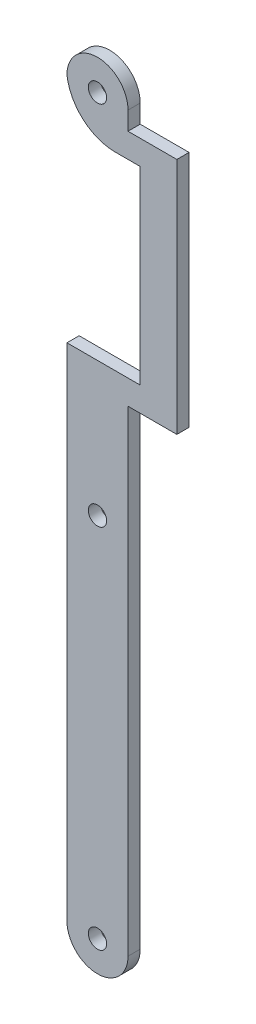
ISO-10303-21;
HEADER;
FILE_DESCRIPTION(('STEP AP214'),'2;1');
FILE_NAME('part.step','',(''),(''),'','','');
FILE_SCHEMA(('AUTOMOTIVE_DESIGN { 1 0 10303 214 1 1 1 1 }'));
ENDSEC;
DATA;
#1=APPLICATION_CONTEXT('core data for automotive mechanical design processes');
#2=APPLICATION_PROTOCOL_DEFINITION('international standard','automotive_design',2000,#1);
#3=PRODUCT_CONTEXT('',#1,'mechanical');
#4=PRODUCT('Part','Part','',(#3));
#5=PRODUCT_RELATED_PRODUCT_CATEGORY('part','',(#4));
#6=PRODUCT_DEFINITION_FORMATION('','',#4);
#7=PRODUCT_DEFINITION_CONTEXT('part definition',#1,'design');
#8=PRODUCT_DEFINITION('design','',#6,#7);
#9=PRODUCT_DEFINITION_SHAPE('','',#8);
#10=(LENGTH_UNIT() NAMED_UNIT(*) SI_UNIT(.MILLI.,.METRE.));
#11=(NAMED_UNIT(*) PLANE_ANGLE_UNIT() SI_UNIT($,.RADIAN.));
#12=(NAMED_UNIT(*) SI_UNIT($,.STERADIAN.) SOLID_ANGLE_UNIT());
#13=UNCERTAINTY_MEASURE_WITH_UNIT(LENGTH_MEASURE(1.E-05),#10,'distance_accuracy_value','');
#14=(GEOMETRIC_REPRESENTATION_CONTEXT(3) GLOBAL_UNCERTAINTY_ASSIGNED_CONTEXT((#13)) GLOBAL_UNIT_ASSIGNED_CONTEXT((#10,
#11,#12)) REPRESENTATION_CONTEXT('',''));
#15=CARTESIAN_POINT('',(0.,0.,0.));
#16=DIRECTION('',(0.,0.,1.));
#17=DIRECTION('',(1.,0.,0.));
#18=AXIS2_PLACEMENT_3D('',#15,#16,#17);
#19=CARTESIAN_POINT('',(5.00000000000001,60.,2.));
#20=DIRECTION('',(-1.,0.,0.));
#21=DIRECTION('',(0.,0.,1.));
#22=AXIS2_PLACEMENT_3D('',#19,#20,#21);
#23=PLANE('',#22);
#24=DIRECTION('',(0.,1.,0.));
#25=VECTOR('',#24,1.);
#26=CARTESIAN_POINT('',(5.00000000000001,60.,0.));
#27=LINE('',#26,#25);
#28=CARTESIAN_POINT('',(5.00000000000001,-60.,0.));
#29=VERTEX_POINT('',#28);
#30=CARTESIAN_POINT('',(5.00000000000001,18.,0.));
#31=VERTEX_POINT('',#30);
#32=EDGE_CURVE('E229',#29,#31,#27,.T.);
#33=ORIENTED_EDGE('',*,*,#32,.T.);
#34=DIRECTION('',(0.,0.,-1.));
#35=VECTOR('',#34,1.);
#36=CARTESIAN_POINT('',(5.00000000000001,18.,2.));
#37=LINE('',#36,#35);
#38=CARTESIAN_POINT('',(5.00000000000001,18.,2.));
#39=VERTEX_POINT('',#38);
#40=EDGE_CURVE('E161',#39,#31,#37,.T.);
#41=ORIENTED_EDGE('',*,*,#40,.F.);
#42=DIRECTION('',(0.,1.,0.));
#43=VECTOR('',#42,1.);
#44=CARTESIAN_POINT('',(5.00000000000001,60.,2.));
#45=LINE('',#44,#43);
#46=CARTESIAN_POINT('',(5.00000000000001,-60.,2.));
#47=VERTEX_POINT('',#46);
#48=EDGE_CURVE('E236',#47,#39,#45,.T.);
#49=ORIENTED_EDGE('',*,*,#48,.F.);
#50=DIRECTION('',(0.,0.,-1.));
#51=VECTOR('',#50,1.);
#52=CARTESIAN_POINT('',(5.00000000000001,-60.,2.));
#53=LINE('',#52,#51);
#54=EDGE_CURVE('E257',#47,#29,#53,.T.);
#55=ORIENTED_EDGE('',*,*,#54,.T.);
#56=EDGE_LOOP('',(#33,#41,#49,#55));
#57=FACE_BOUND('',#56,.T.);
#58=ADVANCED_FACE('F38',(#57),#23,.F.);
#59=CARTESIAN_POINT('',(13.,53.,0.));
#60=DIRECTION('',(0.,-1.,0.));
#61=DIRECTION('',(0.,0.,-1.));
#62=AXIS2_PLACEMENT_3D('',#59,#60,#61);
#63=PLANE('',#62);
#64=DIRECTION('',(-1.,0.,0.));
#65=VECTOR('',#64,1.);
#66=CARTESIAN_POINT('',(13.,53.,2.));
#67=LINE('',#66,#65);
#68=CARTESIAN_POINT('',(7.00000000000001,53.,2.));
#69=VERTEX_POINT('',#68);
#70=CARTESIAN_POINT('',(2.93725393319378,53.,2.));
#71=VERTEX_POINT('',#70);
#72=EDGE_CURVE('E143',#69,#71,#67,.T.);
#73=ORIENTED_EDGE('',*,*,#72,.T.);
#74=DIRECTION('',(0.,0.,1.));
#75=VECTOR('',#74,1.);
#76=CARTESIAN_POINT('',(2.93725393319378,53.,0.));
#77=LINE('',#76,#75);
#78=CARTESIAN_POINT('',(2.93725393319378,53.,0.));
#79=VERTEX_POINT('',#78);
#80=EDGE_CURVE('E272',#71,#79,#77,.F.);
#81=ORIENTED_EDGE('',*,*,#80,.T.);
#82=DIRECTION('',(-1.,0.,0.));
#83=VECTOR('',#82,1.);
#84=CARTESIAN_POINT('',(13.,53.,0.));
#85=LINE('',#84,#83);
#86=CARTESIAN_POINT('',(7.00000000000001,53.,0.));
#87=VERTEX_POINT('',#86);
#88=EDGE_CURVE('E187',#87,#79,#85,.T.);
#89=ORIENTED_EDGE('',*,*,#88,.F.);
#90=DIRECTION('',(0.,0.,-1.));
#91=VECTOR('',#90,1.);
#92=CARTESIAN_POINT('',(7.00000000000001,53.,33.1448230047949));
#93=LINE('',#92,#91);
#94=EDGE_CURVE('E147',#69,#87,#93,.T.);
#95=ORIENTED_EDGE('',*,*,#94,.F.);
#96=EDGE_LOOP('',(#73,#81,#89,#95));
#97=FACE_BOUND('',#96,.T.);
#98=ADVANCED_FACE('F286',(#97),#63,.T.);
#99=CARTESIAN_POINT('',(5.00000000000002,57.,2.));
#100=VERTEX_POINT('',#99);
#101=CARTESIAN_POINT('',(5.00000000000001,60.,2.));
#102=VERTEX_POINT('',#101);
#103=EDGE_CURVE('E235',#100,#102,#45,.T.);
#104=ORIENTED_EDGE('',*,*,#103,.F.);
#105=DIRECTION('',(0.,0.,-1.));
#106=VECTOR('',#105,1.);
#107=CARTESIAN_POINT('',(5.00000000000001,57.,2.));
#108=LINE('',#107,#106);
#109=CARTESIAN_POINT('',(5.00000000000002,57.,0.));
#110=VERTEX_POINT('',#109);
#111=EDGE_CURVE('E268',#100,#110,#108,.T.);
#112=ORIENTED_EDGE('',*,*,#111,.T.);
#113=CARTESIAN_POINT('',(5.00000000000001,60.,0.));
#114=VERTEX_POINT('',#113);
#115=EDGE_CURVE('E250',#110,#114,#27,.T.);
#116=ORIENTED_EDGE('',*,*,#115,.T.);
#117=DIRECTION('',(0.,0.,-1.));
#118=VECTOR('',#117,1.);
#119=CARTESIAN_POINT('',(5.00000000000001,60.,2.));
#120=LINE('',#119,#118);
#121=EDGE_CURVE('E240',#102,#114,#120,.T.);
#122=ORIENTED_EDGE('',*,*,#121,.F.);
#123=EDGE_LOOP('',(#104,#112,#116,#122));
#124=FACE_BOUND('',#123,.T.);
#125=ADVANCED_FACE('F293',(#124),#23,.F.);
#126=CARTESIAN_POINT('',(0.,60.,2.));
#127=DIRECTION('',(0.,0.,1.));
#128=DIRECTION('',(1.,0.,0.));
#129=AXIS2_PLACEMENT_3D('',#126,#127,#128);
#130=PLANE('',#129);
#131=CARTESIAN_POINT('',(0.,60.,2.));
#132=DIRECTION('',(0.,0.,1.));
#133=DIRECTION('',(1.,0.,0.));
#134=AXIS2_PLACEMENT_3D('',#131,#132,#133);
#135=CIRCLE('',#134,5.);
#136=CARTESIAN_POINT('',(-4.99999999999999,60.,2.));
#137=VERTEX_POINT('',#136);
#138=EDGE_CURVE('E225',#102,#137,#135,.T.);
#139=ORIENTED_EDGE('',*,*,#138,.T.);
#140=CARTESIAN_POINT('',(2.93725393319378,61.,2.));
#141=DIRECTION('',(0.,0.,1.));
#142=DIRECTION('',(1.,0.,0.));
#143=AXIS2_PLACEMENT_3D('',#140,#141,#142);
#144=CIRCLE('',#143,8.);
#145=EDGE_CURVE('E11',#137,#71,#144,.T.);
#146=ORIENTED_EDGE('',*,*,#145,.T.);
#147=ORIENTED_EDGE('',*,*,#72,.F.);
#148=DIRECTION('',(0.,1.,0.));
#149=VECTOR('',#148,1.);
#150=CARTESIAN_POINT('',(7.00000000000001,53.,2.));
#151=LINE('',#150,#149);
#152=CARTESIAN_POINT('',(7.00000000000001,22.,2.));
#153=VERTEX_POINT('',#152);
#154=EDGE_CURVE('E140',#153,#69,#151,.T.);
#155=ORIENTED_EDGE('',*,*,#154,.F.);
#156=DIRECTION('',(1.,0.,0.));
#157=VECTOR('',#156,1.);
#158=CARTESIAN_POINT('',(0.527864045000437,22.,2.));
#159=LINE('',#158,#157);
#160=CARTESIAN_POINT('',(-4.99999999999999,22.,2.));
#161=VERTEX_POINT('',#160);
#162=EDGE_CURVE('E126',#161,#153,#159,.T.);
#163=ORIENTED_EDGE('',*,*,#162,.F.);
#164=DIRECTION('',(0.,-1.,0.));
#165=VECTOR('',#164,1.);
#166=CARTESIAN_POINT('',(-4.99999999999999,60.,2.));
#167=LINE('',#166,#165);
#168=CARTESIAN_POINT('',(-5.00000000000001,-60.,2.));
#169=VERTEX_POINT('',#168);
#170=EDGE_CURVE('E228',#161,#169,#167,.T.);
#171=ORIENTED_EDGE('',*,*,#170,.T.);
#172=CARTESIAN_POINT('',(0.,-60.,2.));
#173=DIRECTION('',(0.,0.,1.));
#174=DIRECTION('',(1.,0.,0.));
#175=AXIS2_PLACEMENT_3D('',#172,#173,#174);
#176=CIRCLE('',#175,5.);
#177=EDGE_CURVE('E232',#169,#47,#176,.T.);
#178=ORIENTED_EDGE('',*,*,#177,.T.);
#179=ORIENTED_EDGE('',*,*,#48,.T.);
#180=DIRECTION('',(-1.,0.,0.));
#181=VECTOR('',#180,1.);
#182=CARTESIAN_POINT('',(13.,18.,2.));
#183=LINE('',#182,#181);
#184=CARTESIAN_POINT('',(13.,18.,2.));
#185=VERTEX_POINT('',#184);
#186=EDGE_CURVE('E170',#185,#39,#183,.T.);
#187=ORIENTED_EDGE('',*,*,#186,.F.);
#188=DIRECTION('',(0.,1.,0.));
#189=VECTOR('',#188,1.);
#190=CARTESIAN_POINT('',(13.,57.,2.));
#191=LINE('',#190,#189);
#192=CARTESIAN_POINT('',(13.,57.,2.));
#193=VERTEX_POINT('',#192);
#194=EDGE_CURVE('E180',#185,#193,#191,.T.);
#195=ORIENTED_EDGE('',*,*,#194,.T.);
#196=DIRECTION('',(-1.,0.,0.));
#197=VECTOR('',#196,1.);
#198=CARTESIAN_POINT('',(13.,57.,2.));
#199=LINE('',#198,#197);
#200=EDGE_CURVE('E192',#193,#100,#199,.T.);
#201=ORIENTED_EDGE('',*,*,#200,.T.);
#202=ORIENTED_EDGE('',*,*,#103,.T.);
#203=EDGE_LOOP('',(#139,#146,#147,#155,#163,#171,#178,#179,#187,#195,#201,#202));
#204=FACE_BOUND('',#203,.T.);
#205=CARTESIAN_POINT('',(0.,-60.,2.));
#206=DIRECTION('',(0.,0.,1.));
#207=DIRECTION('',(-1.,0.,0.));
#208=AXIS2_PLACEMENT_3D('',#205,#206,#207);
#209=CIRCLE('',#208,1.5);
#210=CARTESIAN_POINT('',(-1.50000000000001,-60.,2.));
#211=VERTEX_POINT('',#210);
#212=EDGE_CURVE('E209',#211,#211,#209,.T.);
#213=ORIENTED_EDGE('',*,*,#212,.F.);
#214=EDGE_LOOP('',(#213));
#215=FACE_BOUND('',#214,.T.);
#216=CARTESIAN_POINT('',(0.,0.,2.));
#217=DIRECTION('',(0.,0.,1.));
#218=DIRECTION('',(1.,0.,0.));
#219=AXIS2_PLACEMENT_3D('',#216,#217,#218);
#220=CIRCLE('',#219,1.5);
#221=CARTESIAN_POINT('',(1.5,0.,2.));
#222=VERTEX_POINT('',#221);
#223=EDGE_CURVE('E201',#222,#222,#220,.T.);
#224=ORIENTED_EDGE('',*,*,#223,.F.);
#225=EDGE_LOOP('',(#224));
#226=FACE_BOUND('',#225,.T.);
#227=CARTESIAN_POINT('',(0.,60.,2.));
#228=DIRECTION('',(0.,0.,1.));
#229=DIRECTION('',(1.,0.,0.));
#230=AXIS2_PLACEMENT_3D('',#227,#228,#229);
#231=CIRCLE('',#230,1.5);
#232=CARTESIAN_POINT('',(1.49999999999999,60.,2.));
#233=VERTEX_POINT('',#232);
#234=EDGE_CURVE('E217',#233,#233,#231,.T.);
#235=ORIENTED_EDGE('',*,*,#234,.F.);
#236=EDGE_LOOP('',(#235));
#237=FACE_BOUND('',#236,.T.);
#238=ADVANCED_FACE('F141',(#204,#215,#226,#237),#130,.T.);
#239=CARTESIAN_POINT('',(0.,60.,0.));
#240=DIRECTION('',(0.,0.,1.));
#241=DIRECTION('',(1.,0.,0.));
#242=AXIS2_PLACEMENT_3D('',#239,#240,#241);
#243=PLANE('',#242);
#244=ORIENTED_EDGE('',*,*,#88,.T.);
#245=CARTESIAN_POINT('',(2.93725393319378,61.,0.));
#246=DIRECTION('',(0.,0.,1.));
#247=DIRECTION('',(1.,0.,0.));
#248=AXIS2_PLACEMENT_3D('',#245,#246,#247);
#249=CIRCLE('',#248,8.);
#250=CARTESIAN_POINT('',(-4.99999999999999,60.,0.));
#251=VERTEX_POINT('',#250);
#252=EDGE_CURVE('E47',#79,#251,#249,.F.);
#253=ORIENTED_EDGE('',*,*,#252,.T.);
#254=CARTESIAN_POINT('',(0.,60.,0.));
#255=DIRECTION('',(0.,0.,1.));
#256=DIRECTION('',(1.,0.,0.));
#257=AXIS2_PLACEMENT_3D('',#254,#255,#256);
#258=CIRCLE('',#257,5.);
#259=EDGE_CURVE('E221',#114,#251,#258,.T.);
#260=ORIENTED_EDGE('',*,*,#259,.F.);
#261=ORIENTED_EDGE('',*,*,#115,.F.);
#262=DIRECTION('',(-1.,0.,0.));
#263=VECTOR('',#262,1.);
#264=CARTESIAN_POINT('',(13.,57.,0.));
#265=LINE('',#264,#263);
#266=CARTESIAN_POINT('',(13.,57.,0.));
#267=VERTEX_POINT('',#266);
#268=EDGE_CURVE('E188',#267,#110,#265,.T.);
#269=ORIENTED_EDGE('',*,*,#268,.F.);
#270=DIRECTION('',(0.,-1.,0.));
#271=VECTOR('',#270,1.);
#272=CARTESIAN_POINT('',(13.,57.,0.));
#273=LINE('',#272,#271);
#274=CARTESIAN_POINT('',(13.,18.,0.));
#275=VERTEX_POINT('',#274);
#276=EDGE_CURVE('E177',#267,#275,#273,.T.);
#277=ORIENTED_EDGE('',*,*,#276,.T.);
#278=DIRECTION('',(1.,0.,0.));
#279=VECTOR('',#278,1.);
#280=CARTESIAN_POINT('',(13.,18.,0.));
#281=LINE('',#280,#279);
#282=EDGE_CURVE('E173',#31,#275,#281,.T.);
#283=ORIENTED_EDGE('',*,*,#282,.F.);
#284=ORIENTED_EDGE('',*,*,#32,.F.);
#285=CARTESIAN_POINT('',(0.,-60.,0.));
#286=DIRECTION('',(0.,0.,1.));
#287=DIRECTION('',(1.,0.,0.));
#288=AXIS2_PLACEMENT_3D('',#285,#286,#287);
#289=CIRCLE('',#288,5.);
#290=CARTESIAN_POINT('',(-5.00000000000001,-60.,0.));
#291=VERTEX_POINT('',#290);
#292=EDGE_CURVE('E247',#291,#29,#289,.T.);
#293=ORIENTED_EDGE('',*,*,#292,.F.);
#294=DIRECTION('',(0.,-1.,0.));
#295=VECTOR('',#294,1.);
#296=CARTESIAN_POINT('',(-4.99999999999999,60.,0.));
#297=LINE('',#296,#295);
#298=CARTESIAN_POINT('',(-4.99999999999999,22.,0.));
#299=VERTEX_POINT('',#298);
#300=EDGE_CURVE('E244',#299,#291,#297,.T.);
#301=ORIENTED_EDGE('',*,*,#300,.F.);
#302=DIRECTION('',(1.,0.,0.));
#303=VECTOR('',#302,1.);
#304=CARTESIAN_POINT('',(0.527864045000437,22.,0.));
#305=LINE('',#304,#303);
#306=CARTESIAN_POINT('',(7.00000000000001,22.,0.));
#307=VERTEX_POINT('',#306);
#308=EDGE_CURVE('E137',#299,#307,#305,.T.);
#309=ORIENTED_EDGE('',*,*,#308,.T.);
#310=DIRECTION('',(0.,1.,0.));
#311=VECTOR('',#310,1.);
#312=CARTESIAN_POINT('',(7.00000000000001,53.,0.));
#313=LINE('',#312,#311);
#314=EDGE_CURVE('E152',#307,#87,#313,.T.);
#315=ORIENTED_EDGE('',*,*,#314,.T.);
#316=EDGE_LOOP('',(#244,#253,#260,#261,#269,#277,#283,#284,#293,#301,#309,#315));
#317=FACE_BOUND('',#316,.T.);
#318=CARTESIAN_POINT('',(0.,-60.,0.));
#319=DIRECTION('',(0.,0.,1.));
#320=DIRECTION('',(-1.,0.,0.));
#321=AXIS2_PLACEMENT_3D('',#318,#319,#320);
#322=CIRCLE('',#321,1.5);
#323=CARTESIAN_POINT('',(-1.50000000000001,-60.,0.));
#324=VERTEX_POINT('',#323);
#325=EDGE_CURVE('E205',#324,#324,#322,.T.);
#326=ORIENTED_EDGE('',*,*,#325,.T.);
#327=EDGE_LOOP('',(#326));
#328=FACE_BOUND('',#327,.T.);
#329=CARTESIAN_POINT('',(0.,0.,0.));
#330=DIRECTION('',(0.,0.,1.));
#331=DIRECTION('',(1.,0.,0.));
#332=AXIS2_PLACEMENT_3D('',#329,#330,#331);
#333=CIRCLE('',#332,1.5);
#334=CARTESIAN_POINT('',(1.5,0.,0.));
#335=VERTEX_POINT('',#334);
#336=EDGE_CURVE('E191',#335,#335,#333,.T.);
#337=ORIENTED_EDGE('',*,*,#336,.T.);
#338=EDGE_LOOP('',(#337));
#339=FACE_BOUND('',#338,.T.);
#340=CARTESIAN_POINT('',(0.,60.,0.));
#341=DIRECTION('',(0.,0.,1.));
#342=DIRECTION('',(1.,0.,0.));
#343=AXIS2_PLACEMENT_3D('',#340,#341,#342);
#344=CIRCLE('',#343,1.5);
#345=CARTESIAN_POINT('',(1.49999999999999,60.,0.));
#346=VERTEX_POINT('',#345);
#347=EDGE_CURVE('E213',#346,#346,#344,.T.);
#348=ORIENTED_EDGE('',*,*,#347,.T.);
#349=EDGE_LOOP('',(#348));
#350=FACE_BOUND('',#349,.T.);
#351=ADVANCED_FACE('F277',(#317,#328,#339,#350),#243,.F.);
#352=CARTESIAN_POINT('',(0.,60.,2.));
#353=DIRECTION('',(0.,0.,-1.));
#354=DIRECTION('',(-1.,0.,0.));
#355=AXIS2_PLACEMENT_3D('',#352,#353,#354);
#356=CYLINDRICAL_SURFACE('',#355,5.);
#357=ORIENTED_EDGE('',*,*,#259,.T.);
#358=DIRECTION('',(0.,0.,-1.));
#359=VECTOR('',#358,1.);
#360=CARTESIAN_POINT('',(-4.99999999999999,60.,2.));
#361=LINE('',#360,#359);
#362=EDGE_CURVE('E265',#137,#251,#361,.T.);
#363=ORIENTED_EDGE('',*,*,#362,.F.);
#364=ORIENTED_EDGE('',*,*,#138,.F.);
#365=ORIENTED_EDGE('',*,*,#121,.T.);
#366=EDGE_LOOP('',(#357,#363,#364,#365));
#367=FACE_BOUND('',#366,.T.);
#368=ADVANCED_FACE('F282',(#367),#356,.T.);
#369=CARTESIAN_POINT('',(-4.99999999999999,60.,2.));
#370=DIRECTION('',(1.,0.,0.));
#371=DIRECTION('',(0.,0.,-1.));
#372=AXIS2_PLACEMENT_3D('',#369,#370,#371);
#373=PLANE('',#372);
#374=ORIENTED_EDGE('',*,*,#170,.F.);
#375=DIRECTION('',(0.,0.,-1.));
#376=VECTOR('',#375,1.);
#377=CARTESIAN_POINT('',(-4.99999999999999,22.,15.));
#378=LINE('',#377,#376);
#379=EDGE_CURVE('E133',#161,#299,#378,.T.);
#380=ORIENTED_EDGE('',*,*,#379,.T.);
#381=ORIENTED_EDGE('',*,*,#300,.T.);
#382=DIRECTION('',(0.,0.,-1.));
#383=VECTOR('',#382,1.);
#384=CARTESIAN_POINT('',(-5.00000000000001,-60.,2.));
#385=LINE('',#384,#383);
#386=EDGE_CURVE('E261',#169,#291,#385,.T.);
#387=ORIENTED_EDGE('',*,*,#386,.F.);
#388=EDGE_LOOP('',(#374,#380,#381,#387));
#389=FACE_BOUND('',#388,.T.);
#390=ADVANCED_FACE('F402',(#389),#373,.F.);
#391=CARTESIAN_POINT('',(0.,-60.,2.));
#392=DIRECTION('',(0.,0.,-1.));
#393=DIRECTION('',(-1.,0.,0.));
#394=AXIS2_PLACEMENT_3D('',#391,#392,#393);
#395=CYLINDRICAL_SURFACE('',#394,5.);
#396=ORIENTED_EDGE('',*,*,#292,.T.);
#397=ORIENTED_EDGE('',*,*,#54,.F.);
#398=ORIENTED_EDGE('',*,*,#177,.F.);
#399=ORIENTED_EDGE('',*,*,#386,.T.);
#400=EDGE_LOOP('',(#396,#397,#398,#399));
#401=FACE_BOUND('',#400,.T.);
#402=ADVANCED_FACE('F335',(#401),#395,.T.);
#403=CARTESIAN_POINT('',(0.,60.,2.));
#404=DIRECTION('',(0.,0.,-1.));
#405=DIRECTION('',(-1.,0.,0.));
#406=AXIS2_PLACEMENT_3D('',#403,#404,#405);
#407=CYLINDRICAL_SURFACE('',#406,1.5);
#408=ORIENTED_EDGE('',*,*,#234,.T.);
#409=EDGE_LOOP('',(#408));
#410=FACE_BOUND('',#409,.T.);
#411=ORIENTED_EDGE('',*,*,#347,.F.);
#412=EDGE_LOOP('',(#411));
#413=FACE_BOUND('',#412,.T.);
#414=ADVANCED_FACE('F332',(#410,#413),#407,.F.);
#415=CARTESIAN_POINT('',(0.,-60.,2.));
#416=DIRECTION('',(0.,0.,-1.));
#417=DIRECTION('',(-1.,0.,0.));
#418=AXIS2_PLACEMENT_3D('',#415,#416,#417);
#419=CYLINDRICAL_SURFACE('',#418,1.5);
#420=ORIENTED_EDGE('',*,*,#212,.T.);
#421=EDGE_LOOP('',(#420));
#422=FACE_BOUND('',#421,.T.);
#423=ORIENTED_EDGE('',*,*,#325,.F.);
#424=EDGE_LOOP('',(#423));
#425=FACE_BOUND('',#424,.T.);
#426=ADVANCED_FACE('F310',(#422,#425),#419,.F.);
#427=CARTESIAN_POINT('',(0.,0.,2.));
#428=DIRECTION('',(0.,0.,-1.));
#429=DIRECTION('',(-1.,0.,0.));
#430=AXIS2_PLACEMENT_3D('',#427,#428,#429);
#431=CYLINDRICAL_SURFACE('',#430,1.5);
#432=ORIENTED_EDGE('',*,*,#223,.T.);
#433=EDGE_LOOP('',(#432));
#434=FACE_BOUND('',#433,.T.);
#435=ORIENTED_EDGE('',*,*,#336,.F.);
#436=EDGE_LOOP('',(#435));
#437=FACE_BOUND('',#436,.T.);
#438=ADVANCED_FACE('F302',(#434,#437),#431,.F.);
#439=CARTESIAN_POINT('',(13.,57.,0.));
#440=DIRECTION('',(0.,1.,0.));
#441=DIRECTION('',(0.,0.,1.));
#442=AXIS2_PLACEMENT_3D('',#439,#440,#441);
#443=PLANE('',#442);
#444=ORIENTED_EDGE('',*,*,#111,.F.);
#445=ORIENTED_EDGE('',*,*,#200,.F.);
#446=DIRECTION('',(0.,0.,-1.));
#447=VECTOR('',#446,1.);
#448=CARTESIAN_POINT('',(13.,57.,0.));
#449=LINE('',#448,#447);
#450=EDGE_CURVE('E183',#193,#267,#449,.T.);
#451=ORIENTED_EDGE('',*,*,#450,.T.);
#452=ORIENTED_EDGE('',*,*,#268,.T.);
#453=EDGE_LOOP('',(#444,#445,#451,#452));
#454=FACE_BOUND('',#453,.T.);
#455=ADVANCED_FACE('F300',(#454),#443,.T.);
#456=CARTESIAN_POINT('',(13.,0.,0.));
#457=DIRECTION('',(-1.,0.,0.));
#458=DIRECTION('',(0.,0.,1.));
#459=AXIS2_PLACEMENT_3D('',#456,#457,#458);
#460=PLANE('',#459);
#461=ORIENTED_EDGE('',*,*,#450,.F.);
#462=ORIENTED_EDGE('',*,*,#194,.F.);
#463=DIRECTION('',(0.,0.,1.));
#464=VECTOR('',#463,1.);
#465=CARTESIAN_POINT('',(13.,18.,0.));
#466=LINE('',#465,#464);
#467=EDGE_CURVE('E136',#275,#185,#466,.T.);
#468=ORIENTED_EDGE('',*,*,#467,.F.);
#469=ORIENTED_EDGE('',*,*,#276,.F.);
#470=EDGE_LOOP('',(#461,#462,#468,#469));
#471=FACE_BOUND('',#470,.T.);
#472=ADVANCED_FACE('F299',(#471),#460,.F.);
#473=CARTESIAN_POINT('',(0.,18.,0.));
#474=DIRECTION('',(0.,-1.,0.));
#475=DIRECTION('',(0.,0.,-1.));
#476=AXIS2_PLACEMENT_3D('',#473,#474,#475);
#477=PLANE('',#476);
#478=ORIENTED_EDGE('',*,*,#467,.T.);
#479=ORIENTED_EDGE('',*,*,#186,.T.);
#480=ORIENTED_EDGE('',*,*,#40,.T.);
#481=ORIENTED_EDGE('',*,*,#282,.T.);
#482=EDGE_LOOP('',(#478,#479,#480,#481));
#483=FACE_BOUND('',#482,.T.);
#484=ADVANCED_FACE('F308',(#483),#477,.T.);
#485=CARTESIAN_POINT('',(0.527864045000437,22.,2.));
#486=DIRECTION('',(0.,1.,0.));
#487=DIRECTION('',(0.,0.,1.));
#488=AXIS2_PLACEMENT_3D('',#485,#486,#487);
#489=PLANE('',#488);
#490=DIRECTION('',(0.,0.,-1.));
#491=VECTOR('',#490,1.);
#492=CARTESIAN_POINT('',(7.00000000000001,22.,33.1448230047949));
#493=LINE('',#492,#491);
#494=EDGE_CURVE('E130',#153,#307,#493,.T.);
#495=ORIENTED_EDGE('',*,*,#494,.T.);
#496=ORIENTED_EDGE('',*,*,#308,.F.);
#497=ORIENTED_EDGE('',*,*,#379,.F.);
#498=ORIENTED_EDGE('',*,*,#162,.T.);
#499=EDGE_LOOP('',(#495,#496,#497,#498));
#500=FACE_BOUND('',#499,.T.);
#501=ADVANCED_FACE('F128',(#500),#489,.T.);
#502=CARTESIAN_POINT('',(7.00000000000001,53.,33.1448230047949));
#503=DIRECTION('',(-1.,0.,0.));
#504=DIRECTION('',(0.,-1.,0.));
#505=AXIS2_PLACEMENT_3D('',#502,#503,#504);
#506=PLANE('',#505);
#507=ORIENTED_EDGE('',*,*,#494,.F.);
#508=ORIENTED_EDGE('',*,*,#154,.T.);
#509=ORIENTED_EDGE('',*,*,#94,.T.);
#510=ORIENTED_EDGE('',*,*,#314,.F.);
#511=EDGE_LOOP('',(#507,#508,#509,#510));
#512=FACE_BOUND('',#511,.T.);
#513=ADVANCED_FACE('F150',(#512),#506,.T.);
#514=CARTESIAN_POINT('',(2.93725393319378,61.,2.));
#515=DIRECTION('',(0.,0.,-1.));
#516=DIRECTION('',(-1.,0.,0.));
#517=AXIS2_PLACEMENT_3D('',#514,#515,#516);
#518=CYLINDRICAL_SURFACE('',#517,8.);
#519=ORIENTED_EDGE('',*,*,#145,.F.);
#520=ORIENTED_EDGE('',*,*,#362,.T.);
#521=ORIENTED_EDGE('',*,*,#252,.F.);
#522=ORIENTED_EDGE('',*,*,#80,.F.);
#523=EDGE_LOOP('',(#519,#520,#521,#522));
#524=FACE_BOUND('',#523,.T.);
#525=ADVANCED_FACE('F40',(#524),#518,.T.);
#526=CLOSED_SHELL('',(#58,#98,#125,#238,#351,#368,#390,#402,#414,#426,#438,#455,#472,#484,#501,
#513,#525));
#527=MANIFOLD_SOLID_BREP('B2',#526);
#528=ADVANCED_BREP_SHAPE_REPRESENTATION('',(#18,#527),#14);
#529=SHAPE_DEFINITION_REPRESENTATION(#9,#528);
ENDSEC;
END-ISO-10303-21;
